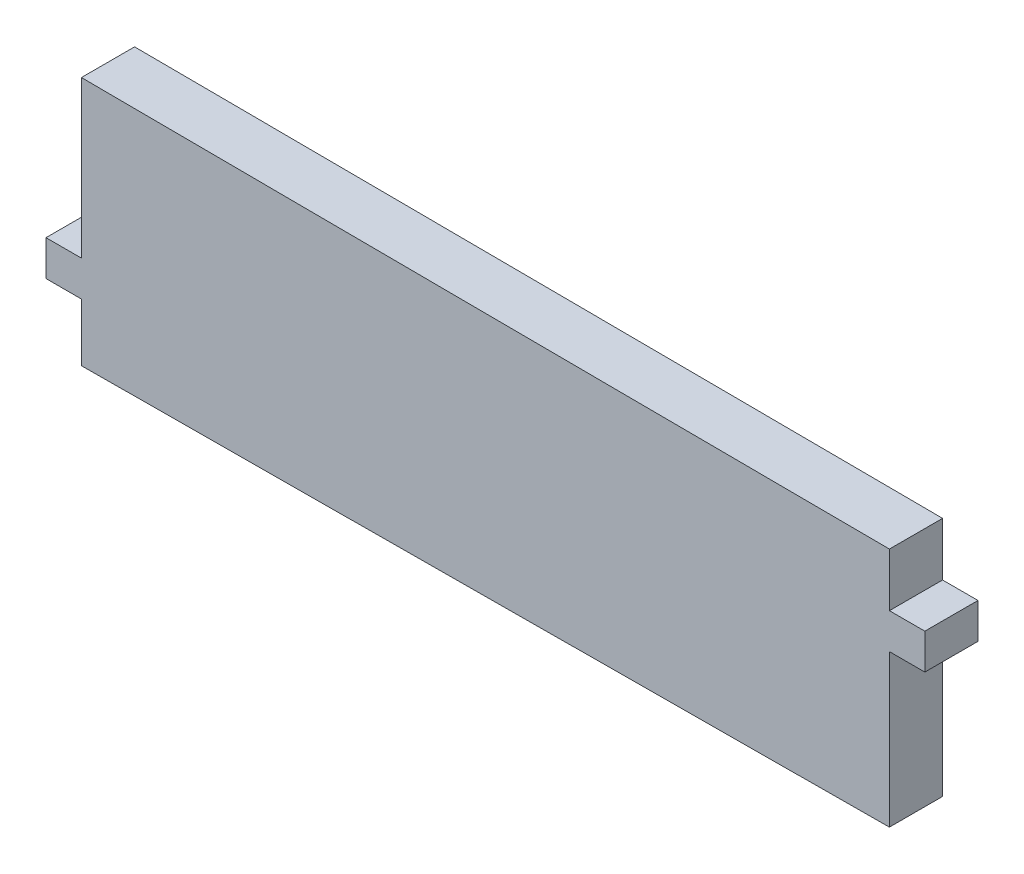
ISO-10303-21;
HEADER;
FILE_DESCRIPTION(('STEP AP214'),'2;1');
FILE_NAME('part.step','',(''),(''),'','','');
FILE_SCHEMA(('AUTOMOTIVE_DESIGN { 1 0 10303 214 1 1 1 1 }'));
ENDSEC;
DATA;
#1=APPLICATION_CONTEXT('core data for automotive mechanical design processes');
#2=APPLICATION_PROTOCOL_DEFINITION('international standard','automotive_design',2000,#1);
#3=PRODUCT_CONTEXT('',#1,'mechanical');
#4=PRODUCT('Part','Part','',(#3));
#5=PRODUCT_RELATED_PRODUCT_CATEGORY('part','',(#4));
#6=PRODUCT_DEFINITION_FORMATION('','',#4);
#7=PRODUCT_DEFINITION_CONTEXT('part definition',#1,'design');
#8=PRODUCT_DEFINITION('design','',#6,#7);
#9=PRODUCT_DEFINITION_SHAPE('','',#8);
#10=(LENGTH_UNIT() NAMED_UNIT(*) SI_UNIT(.MILLI.,.METRE.));
#11=(NAMED_UNIT(*) PLANE_ANGLE_UNIT() SI_UNIT($,.RADIAN.));
#12=(NAMED_UNIT(*) SI_UNIT($,.STERADIAN.) SOLID_ANGLE_UNIT());
#13=UNCERTAINTY_MEASURE_WITH_UNIT(LENGTH_MEASURE(1.E-05),#10,'distance_accuracy_value','');
#14=(GEOMETRIC_REPRESENTATION_CONTEXT(3) GLOBAL_UNCERTAINTY_ASSIGNED_CONTEXT((#13)) GLOBAL_UNIT_ASSIGNED_CONTEXT((#10,
#11,#12)) REPRESENTATION_CONTEXT('',''));
#15=CARTESIAN_POINT('',(0.,0.,0.));
#16=DIRECTION('',(0.,0.,1.));
#17=DIRECTION('',(1.,0.,0.));
#18=AXIS2_PLACEMENT_3D('',#15,#16,#17);
#19=CARTESIAN_POINT('',(84.671798957982,-9.79492731447698,86.6164298576074));
#20=DIRECTION('',(1.,0.,0.));
#21=DIRECTION('',(0.,0.,-1.));
#22=AXIS2_PLACEMENT_3D('',#19,#20,#21);
#23=PLANE('',#22);
#24=DIRECTION('',(0.,-1.,0.));
#25=VECTOR('',#24,1.);
#26=CARTESIAN_POINT('',(84.671798957982,-9.79492731447698,4.7625));
#27=LINE('',#26,#25);
#28=CARTESIAN_POINT('',(84.671798957982,-9.79492731447698,4.7625));
#29=VERTEX_POINT('',#28);
#30=CARTESIAN_POINT('',(84.671798957982,-14.9693048165318,4.7625));
#31=VERTEX_POINT('',#30);
#32=EDGE_CURVE('E167',#29,#31,#27,.T.);
#33=ORIENTED_EDGE('',*,*,#32,.F.);
#34=DIRECTION('',(0.,0.,-1.));
#35=VECTOR('',#34,1.);
#36=CARTESIAN_POINT('',(84.671798957982,-9.79492731447698,86.6164298576074));
#37=LINE('',#36,#35);
#38=CARTESIAN_POINT('',(84.671798957982,-9.79492731447698,0.));
#39=VERTEX_POINT('',#38);
#40=EDGE_CURVE('E36',#29,#39,#37,.T.);
#41=ORIENTED_EDGE('',*,*,#40,.T.);
#42=DIRECTION('',(0.,-1.,0.));
#43=VECTOR('',#42,1.);
#44=CARTESIAN_POINT('',(84.671798957982,-9.79492731447698,0.));
#45=LINE('',#44,#43);
#46=CARTESIAN_POINT('',(84.671798957982,-14.9693048165318,0.));
#47=VERTEX_POINT('',#46);
#48=EDGE_CURVE('E175',#39,#47,#45,.T.);
#49=ORIENTED_EDGE('',*,*,#48,.T.);
#50=DIRECTION('',(0.,0.,-1.));
#51=VECTOR('',#50,1.);
#52=CARTESIAN_POINT('',(84.671798957982,-14.9693048165318,86.6164298576074));
#53=LINE('',#52,#51);
#54=EDGE_CURVE('E103',#31,#47,#53,.T.);
#55=ORIENTED_EDGE('',*,*,#54,.F.);
#56=EDGE_LOOP('',(#33,#41,#49,#55));
#57=FACE_BOUND('',#56,.T.);
#58=ADVANCED_FACE('F32',(#57),#23,.F.);
#59=CARTESIAN_POINT('',(157.061798957982,-14.5780269112379,86.6164298576074));
#60=DIRECTION('',(-0.00540505856785546,0.99998539256425,0.));
#61=DIRECTION('',(-0.99998539256425,-0.00540505856785546,0.));
#62=AXIS2_PLACEMENT_3D('',#59,#60,#61);
#63=PLANE('',#62);
#64=DIRECTION('',(0.99998539256425,0.00540505856785546,0.));
#65=VECTOR('',#64,1.);
#66=CARTESIAN_POINT('',(157.061798957982,-14.5780269112379,4.7625));
#67=LINE('',#66,#65);
#68=CARTESIAN_POINT('',(157.061798957982,-14.5780269112379,4.7625));
#69=VERTEX_POINT('',#68);
#70=EDGE_CURVE('E110',#31,#69,#67,.T.);
#71=ORIENTED_EDGE('',*,*,#70,.F.);
#72=ORIENTED_EDGE('',*,*,#54,.T.);
#73=DIRECTION('',(0.99998539256425,0.00540505856785546,0.));
#74=VECTOR('',#73,1.);
#75=CARTESIAN_POINT('',(157.061798957982,-14.5780269112379,0.));
#76=LINE('',#75,#74);
#77=CARTESIAN_POINT('',(157.061798957982,-14.5780269112379,0.));
#78=VERTEX_POINT('',#77);
#79=EDGE_CURVE('E174',#47,#78,#76,.T.);
#80=ORIENTED_EDGE('',*,*,#79,.T.);
#81=DIRECTION('',(0.,0.,-1.));
#82=VECTOR('',#81,1.);
#83=CARTESIAN_POINT('',(157.061798957982,-14.5780269112379,86.6164298576074));
#84=LINE('',#83,#82);
#85=EDGE_CURVE('E176',#69,#78,#84,.T.);
#86=ORIENTED_EDGE('',*,*,#85,.F.);
#87=EDGE_LOOP('',(#71,#72,#80,#86));
#88=FACE_BOUND('',#87,.T.);
#89=ADVANCED_FACE('F225',(#88),#63,.F.);
#90=CARTESIAN_POINT('',(157.061798957982,-0.955727314476965,86.6164298576074));
#91=DIRECTION('',(-1.,0.,0.));
#92=DIRECTION('',(0.,0.,1.));
#93=AXIS2_PLACEMENT_3D('',#90,#91,#92);
#94=PLANE('',#93);
#95=DIRECTION('',(0.,1.,0.));
#96=VECTOR('',#95,1.);
#97=CARTESIAN_POINT('',(157.061798957982,-0.955727314476965,4.7625));
#98=LINE('',#97,#96);
#99=CARTESIAN_POINT('',(157.061798957982,-0.955727314476965,4.7625));
#100=VERTEX_POINT('',#99);
#101=EDGE_CURVE('E163',#69,#100,#98,.T.);
#102=ORIENTED_EDGE('',*,*,#101,.F.);
#103=ORIENTED_EDGE('',*,*,#85,.T.);
#104=DIRECTION('',(0.,1.,0.));
#105=VECTOR('',#104,1.);
#106=CARTESIAN_POINT('',(157.061798957982,-0.955727314476965,0.));
#107=LINE('',#106,#105);
#108=CARTESIAN_POINT('',(157.061798957982,-0.955727314476965,0.));
#109=VERTEX_POINT('',#108);
#110=EDGE_CURVE('E178',#78,#109,#107,.T.);
#111=ORIENTED_EDGE('',*,*,#110,.T.);
#112=DIRECTION('',(0.,0.,-1.));
#113=VECTOR('',#112,1.);
#114=CARTESIAN_POINT('',(157.061798957982,-0.955727314476965,86.6164298576074));
#115=LINE('',#114,#113);
#116=EDGE_CURVE('E179',#100,#109,#115,.T.);
#117=ORIENTED_EDGE('',*,*,#116,.F.);
#118=EDGE_LOOP('',(#102,#103,#111,#117));
#119=FACE_BOUND('',#118,.T.);
#120=ADVANCED_FACE('F228',(#119),#94,.F.);
#121=CARTESIAN_POINT('',(160.236798957982,-0.955727314476965,86.6164298576074));
#122=DIRECTION('',(0.,1.,0.));
#123=DIRECTION('',(0.,0.,1.));
#124=AXIS2_PLACEMENT_3D('',#121,#122,#123);
#125=PLANE('',#124);
#126=DIRECTION('',(1.,0.,0.));
#127=VECTOR('',#126,1.);
#128=CARTESIAN_POINT('',(160.236798957982,-0.955727314476965,4.7625));
#129=LINE('',#128,#127);
#130=CARTESIAN_POINT('',(160.236798957982,-0.955727314476965,4.7625));
#131=VERTEX_POINT('',#130);
#132=EDGE_CURVE('E160',#100,#131,#129,.T.);
#133=ORIENTED_EDGE('',*,*,#132,.F.);
#134=ORIENTED_EDGE('',*,*,#116,.T.);
#135=DIRECTION('',(1.,0.,0.));
#136=VECTOR('',#135,1.);
#137=CARTESIAN_POINT('',(160.236798957982,-0.955727314476965,0.));
#138=LINE('',#137,#136);
#139=CARTESIAN_POINT('',(160.236798957982,-0.955727314476965,0.));
#140=VERTEX_POINT('',#139);
#141=EDGE_CURVE('E181',#109,#140,#138,.T.);
#142=ORIENTED_EDGE('',*,*,#141,.T.);
#143=DIRECTION('',(0.,0.,-1.));
#144=VECTOR('',#143,1.);
#145=CARTESIAN_POINT('',(160.236798957982,-0.955727314476965,86.6164298576074));
#146=LINE('',#145,#144);
#147=EDGE_CURVE('E182',#131,#140,#146,.T.);
#148=ORIENTED_EDGE('',*,*,#147,.F.);
#149=EDGE_LOOP('',(#133,#134,#142,#148));
#150=FACE_BOUND('',#149,.T.);
#151=ADVANCED_FACE('F230',(#150),#125,.F.);
#152=CARTESIAN_POINT('',(160.236798957982,2.21927268552303,86.6164298576074));
#153=DIRECTION('',(-1.,0.,0.));
#154=DIRECTION('',(0.,0.,1.));
#155=AXIS2_PLACEMENT_3D('',#152,#153,#154);
#156=PLANE('',#155);
#157=DIRECTION('',(0.,1.,0.));
#158=VECTOR('',#157,1.);
#159=CARTESIAN_POINT('',(160.236798957982,2.21927268552303,4.7625));
#160=LINE('',#159,#158);
#161=CARTESIAN_POINT('',(160.236798957982,2.21927268552303,4.7625));
#162=VERTEX_POINT('',#161);
#163=EDGE_CURVE('E157',#131,#162,#160,.T.);
#164=ORIENTED_EDGE('',*,*,#163,.F.);
#165=ORIENTED_EDGE('',*,*,#147,.T.);
#166=DIRECTION('',(0.,1.,0.));
#167=VECTOR('',#166,1.);
#168=CARTESIAN_POINT('',(160.236798957982,2.21927268552303,0.));
#169=LINE('',#168,#167);
#170=CARTESIAN_POINT('',(160.236798957982,2.21927268552303,0.));
#171=VERTEX_POINT('',#170);
#172=EDGE_CURVE('E184',#140,#171,#169,.T.);
#173=ORIENTED_EDGE('',*,*,#172,.T.);
#174=DIRECTION('',(0.,0.,-1.));
#175=VECTOR('',#174,1.);
#176=CARTESIAN_POINT('',(160.236798957982,2.21927268552303,86.6164298576074));
#177=LINE('',#176,#175);
#178=EDGE_CURVE('E185',#162,#171,#177,.T.);
#179=ORIENTED_EDGE('',*,*,#178,.F.);
#180=EDGE_LOOP('',(#164,#165,#173,#179));
#181=FACE_BOUND('',#180,.T.);
#182=ADVANCED_FACE('F234',(#181),#156,.F.);
#183=CARTESIAN_POINT('',(157.061798957982,2.21927268552303,86.6164298576074));
#184=DIRECTION('',(0.,-1.,0.));
#185=DIRECTION('',(0.,0.,-1.));
#186=AXIS2_PLACEMENT_3D('',#183,#184,#185);
#187=PLANE('',#186);
#188=DIRECTION('',(-1.,0.,0.));
#189=VECTOR('',#188,1.);
#190=CARTESIAN_POINT('',(157.061798957982,2.21927268552303,4.7625));
#191=LINE('',#190,#189);
#192=CARTESIAN_POINT('',(157.061798957982,2.21927268552303,4.7625));
#193=VERTEX_POINT('',#192);
#194=EDGE_CURVE('E154',#162,#193,#191,.T.);
#195=ORIENTED_EDGE('',*,*,#194,.F.);
#196=ORIENTED_EDGE('',*,*,#178,.T.);
#197=DIRECTION('',(-1.,0.,0.));
#198=VECTOR('',#197,1.);
#199=CARTESIAN_POINT('',(157.061798957982,2.21927268552303,0.));
#200=LINE('',#199,#198);
#201=CARTESIAN_POINT('',(157.061798957982,2.21927268552303,0.));
#202=VERTEX_POINT('',#201);
#203=EDGE_CURVE('E187',#171,#202,#200,.T.);
#204=ORIENTED_EDGE('',*,*,#203,.T.);
#205=DIRECTION('',(0.,0.,-1.));
#206=VECTOR('',#205,1.);
#207=CARTESIAN_POINT('',(157.061798957982,2.21927268552303,86.6164298576074));
#208=LINE('',#207,#206);
#209=EDGE_CURVE('E188',#193,#202,#208,.T.);
#210=ORIENTED_EDGE('',*,*,#209,.F.);
#211=EDGE_LOOP('',(#195,#196,#204,#210));
#212=FACE_BOUND('',#211,.T.);
#213=ADVANCED_FACE('F239',(#212),#187,.F.);
#214=CARTESIAN_POINT('',(157.061798957982,2.21927268552303,86.6164298576074));
#215=DIRECTION('',(-1.,0.,0.));
#216=DIRECTION('',(0.,-1.,0.));
#217=AXIS2_PLACEMENT_3D('',#214,#215,#216);
#218=PLANE('',#217);
#219=DIRECTION('',(0.,1.,0.));
#220=VECTOR('',#219,1.);
#221=CARTESIAN_POINT('',(157.061798957982,2.21927268552303,4.7625));
#222=LINE('',#221,#220);
#223=CARTESIAN_POINT('',(157.061798957982,7.00220266907081,4.7625));
#224=VERTEX_POINT('',#223);
#225=EDGE_CURVE('E151',#193,#224,#222,.T.);
#226=ORIENTED_EDGE('',*,*,#225,.F.);
#227=ORIENTED_EDGE('',*,*,#209,.T.);
#228=DIRECTION('',(0.,1.,0.));
#229=VECTOR('',#228,1.);
#230=CARTESIAN_POINT('',(157.061798957982,2.21927268552303,0.));
#231=LINE('',#230,#229);
#232=CARTESIAN_POINT('',(157.061798957982,7.00220266907081,0.));
#233=VERTEX_POINT('',#232);
#234=EDGE_CURVE('E190',#202,#233,#231,.T.);
#235=ORIENTED_EDGE('',*,*,#234,.T.);
#236=DIRECTION('',(0.,0.,-1.));
#237=VECTOR('',#236,1.);
#238=CARTESIAN_POINT('',(157.061798957982,7.00220266907081,86.6164298576074));
#239=LINE('',#238,#237);
#240=EDGE_CURVE('E191',#224,#233,#239,.T.);
#241=ORIENTED_EDGE('',*,*,#240,.F.);
#242=EDGE_LOOP('',(#226,#227,#235,#241));
#243=FACE_BOUND('',#242,.T.);
#244=ADVANCED_FACE('F242',(#243),#218,.F.);
#245=CARTESIAN_POINT('',(157.061798957982,7.00220266907081,86.6164298576074));
#246=DIRECTION('',(-0.00540013630427088,-0.999985419157647,0.));
#247=DIRECTION('',(0.999985419157647,-0.00540013630427088,0.));
#248=AXIS2_PLACEMENT_3D('',#245,#246,#247);
#249=PLANE('',#248);
#250=DIRECTION('',(-0.999985419157647,0.00540013630427088,0.));
#251=VECTOR('',#250,1.);
#252=CARTESIAN_POINT('',(157.061798957982,7.00220266907081,4.7625));
#253=LINE('',#252,#251);
#254=CARTESIAN_POINT('',(84.671798957982,7.39312423610272,4.7625));
#255=VERTEX_POINT('',#254);
#256=EDGE_CURVE('E146',#224,#255,#253,.T.);
#257=ORIENTED_EDGE('',*,*,#256,.F.);
#258=ORIENTED_EDGE('',*,*,#240,.T.);
#259=DIRECTION('',(-0.999985419157647,0.00540013630427088,0.));
#260=VECTOR('',#259,1.);
#261=CARTESIAN_POINT('',(157.061798957982,7.00220266907081,0.));
#262=LINE('',#261,#260);
#263=CARTESIAN_POINT('',(84.671798957982,7.39312423610272,0.));
#264=VERTEX_POINT('',#263);
#265=EDGE_CURVE('E193',#233,#264,#262,.T.);
#266=ORIENTED_EDGE('',*,*,#265,.T.);
#267=DIRECTION('',(0.,0.,-1.));
#268=VECTOR('',#267,1.);
#269=CARTESIAN_POINT('',(84.671798957982,7.39312423610272,86.6164298576074));
#270=LINE('',#269,#268);
#271=EDGE_CURVE('E194',#255,#264,#270,.T.);
#272=ORIENTED_EDGE('',*,*,#271,.F.);
#273=EDGE_LOOP('',(#257,#258,#266,#272));
#274=FACE_BOUND('',#273,.T.);
#275=ADVANCED_FACE('F246',(#274),#249,.F.);
#276=CARTESIAN_POINT('',(84.671798957982,-6.61992731447698,86.6164298576074));
#277=DIRECTION('',(1.,0.,0.));
#278=DIRECTION('',(0.,0.,-1.));
#279=AXIS2_PLACEMENT_3D('',#276,#277,#278);
#280=PLANE('',#279);
#281=DIRECTION('',(0.,-1.,0.));
#282=VECTOR('',#281,1.);
#283=CARTESIAN_POINT('',(84.671798957982,-6.61992731447698,4.7625));
#284=LINE('',#283,#282);
#285=CARTESIAN_POINT('',(84.671798957982,-6.61992731447698,4.7625));
#286=VERTEX_POINT('',#285);
#287=EDGE_CURVE('E144',#255,#286,#284,.T.);
#288=ORIENTED_EDGE('',*,*,#287,.F.);
#289=ORIENTED_EDGE('',*,*,#271,.T.);
#290=DIRECTION('',(0.,-1.,0.));
#291=VECTOR('',#290,1.);
#292=CARTESIAN_POINT('',(84.671798957982,-6.61992731447698,0.));
#293=LINE('',#292,#291);
#294=CARTESIAN_POINT('',(84.671798957982,-6.61992731447698,0.));
#295=VERTEX_POINT('',#294);
#296=EDGE_CURVE('E196',#264,#295,#293,.T.);
#297=ORIENTED_EDGE('',*,*,#296,.T.);
#298=DIRECTION('',(0.,0.,-1.));
#299=VECTOR('',#298,1.);
#300=CARTESIAN_POINT('',(84.671798957982,-6.61992731447698,86.6164298576074));
#301=LINE('',#300,#299);
#302=EDGE_CURVE('E197',#286,#295,#301,.T.);
#303=ORIENTED_EDGE('',*,*,#302,.F.);
#304=EDGE_LOOP('',(#288,#289,#297,#303));
#305=FACE_BOUND('',#304,.T.);
#306=ADVANCED_FACE('F250',(#305),#280,.F.);
#307=CARTESIAN_POINT('',(81.496798957982,-6.61992731447698,86.6164298576074));
#308=DIRECTION('',(0.,-1.,0.));
#309=DIRECTION('',(0.,0.,-1.));
#310=AXIS2_PLACEMENT_3D('',#307,#308,#309);
#311=PLANE('',#310);
#312=DIRECTION('',(-1.,0.,0.));
#313=VECTOR('',#312,1.);
#314=CARTESIAN_POINT('',(81.496798957982,-6.61992731447698,4.7625));
#315=LINE('',#314,#313);
#316=CARTESIAN_POINT('',(81.496798957982,-6.61992731447698,4.7625));
#317=VERTEX_POINT('',#316);
#318=EDGE_CURVE('E41',#286,#317,#315,.T.);
#319=ORIENTED_EDGE('',*,*,#318,.F.);
#320=ORIENTED_EDGE('',*,*,#302,.T.);
#321=DIRECTION('',(-1.,0.,0.));
#322=VECTOR('',#321,1.);
#323=CARTESIAN_POINT('',(81.496798957982,-6.61992731447698,0.));
#324=LINE('',#323,#322);
#325=CARTESIAN_POINT('',(81.496798957982,-6.61992731447698,0.));
#326=VERTEX_POINT('',#325);
#327=EDGE_CURVE('E138',#295,#326,#324,.T.);
#328=ORIENTED_EDGE('',*,*,#327,.T.);
#329=DIRECTION('',(0.,0.,-1.));
#330=VECTOR('',#329,1.);
#331=CARTESIAN_POINT('',(81.496798957982,-6.61992731447698,86.6164298576074));
#332=LINE('',#331,#330);
#333=EDGE_CURVE('E129',#317,#326,#332,.T.);
#334=ORIENTED_EDGE('',*,*,#333,.F.);
#335=EDGE_LOOP('',(#319,#320,#328,#334));
#336=FACE_BOUND('',#335,.T.);
#337=ADVANCED_FACE('F135',(#336),#311,.F.);
#338=CARTESIAN_POINT('',(81.496798957982,-9.79492731447698,86.6164298576074));
#339=DIRECTION('',(1.,0.,0.));
#340=DIRECTION('',(0.,0.,-1.));
#341=AXIS2_PLACEMENT_3D('',#338,#339,#340);
#342=PLANE('',#341);
#343=DIRECTION('',(0.,-1.,0.));
#344=VECTOR('',#343,1.);
#345=CARTESIAN_POINT('',(81.496798957982,-9.79492731447698,4.7625));
#346=LINE('',#345,#344);
#347=CARTESIAN_POINT('',(81.496798957982,-9.79492731447698,4.7625));
#348=VERTEX_POINT('',#347);
#349=EDGE_CURVE('E11',#317,#348,#346,.T.);
#350=ORIENTED_EDGE('',*,*,#349,.F.);
#351=ORIENTED_EDGE('',*,*,#333,.T.);
#352=DIRECTION('',(0.,-1.,0.));
#353=VECTOR('',#352,1.);
#354=CARTESIAN_POINT('',(81.496798957982,-9.79492731447698,0.));
#355=LINE('',#354,#353);
#356=CARTESIAN_POINT('',(81.496798957982,-9.79492731447698,0.));
#357=VERTEX_POINT('',#356);
#358=EDGE_CURVE('E140',#326,#357,#355,.T.);
#359=ORIENTED_EDGE('',*,*,#358,.T.);
#360=DIRECTION('',(0.,0.,-1.));
#361=VECTOR('',#360,1.);
#362=CARTESIAN_POINT('',(81.496798957982,-9.79492731447698,86.6164298576074));
#363=LINE('',#362,#361);
#364=EDGE_CURVE('E54',#348,#357,#363,.T.);
#365=ORIENTED_EDGE('',*,*,#364,.F.);
#366=EDGE_LOOP('',(#350,#351,#359,#365));
#367=FACE_BOUND('',#366,.T.);
#368=ADVANCED_FACE('F128',(#367),#342,.F.);
#369=CARTESIAN_POINT('',(84.671798957982,-9.79492731447698,86.6164298576074));
#370=DIRECTION('',(0.,1.,0.));
#371=DIRECTION('',(0.,0.,1.));
#372=AXIS2_PLACEMENT_3D('',#369,#370,#371);
#373=PLANE('',#372);
#374=DIRECTION('',(1.,0.,0.));
#375=VECTOR('',#374,1.);
#376=CARTESIAN_POINT('',(84.671798957982,-9.79492731447698,4.7625));
#377=LINE('',#376,#375);
#378=EDGE_CURVE('E170',#348,#29,#377,.T.);
#379=ORIENTED_EDGE('',*,*,#378,.F.);
#380=ORIENTED_EDGE('',*,*,#364,.T.);
#381=DIRECTION('',(1.,0.,0.));
#382=VECTOR('',#381,1.);
#383=CARTESIAN_POINT('',(84.671798957982,-9.79492731447698,0.));
#384=LINE('',#383,#382);
#385=EDGE_CURVE('E172',#357,#39,#384,.T.);
#386=ORIENTED_EDGE('',*,*,#385,.T.);
#387=ORIENTED_EDGE('',*,*,#40,.F.);
#388=EDGE_LOOP('',(#379,#380,#386,#387));
#389=FACE_BOUND('',#388,.T.);
#390=ADVANCED_FACE('F220',(#389),#373,.F.);
#391=CARTESIAN_POINT('',(0.,0.,0.));
#392=DIRECTION('',(0.,0.,-1.));
#393=DIRECTION('',(-1.,0.,0.));
#394=AXIS2_PLACEMENT_3D('',#391,#392,#393);
#395=PLANE('',#394);
#396=ORIENTED_EDGE('',*,*,#48,.F.);
#397=ORIENTED_EDGE('',*,*,#385,.F.);
#398=ORIENTED_EDGE('',*,*,#358,.F.);
#399=ORIENTED_EDGE('',*,*,#327,.F.);
#400=ORIENTED_EDGE('',*,*,#296,.F.);
#401=ORIENTED_EDGE('',*,*,#265,.F.);
#402=ORIENTED_EDGE('',*,*,#234,.F.);
#403=ORIENTED_EDGE('',*,*,#203,.F.);
#404=ORIENTED_EDGE('',*,*,#172,.F.);
#405=ORIENTED_EDGE('',*,*,#141,.F.);
#406=ORIENTED_EDGE('',*,*,#110,.F.);
#407=ORIENTED_EDGE('',*,*,#79,.F.);
#408=EDGE_LOOP('',(#396,#397,#398,#399,#400,#401,#402,#403,#404,#405,#406,#407));
#409=FACE_BOUND('',#408,.T.);
#410=ADVANCED_FACE('F222',(#409),#395,.T.);
#411=CARTESIAN_POINT('',(311.489607799998,-9.79492731447698,4.7625));
#412=DIRECTION('',(0.,0.,1.));
#413=DIRECTION('',(1.,0.,0.));
#414=AXIS2_PLACEMENT_3D('',#411,#412,#413);
#415=PLANE('',#414);
#416=ORIENTED_EDGE('',*,*,#378,.T.);
#417=ORIENTED_EDGE('',*,*,#32,.T.);
#418=ORIENTED_EDGE('',*,*,#70,.T.);
#419=ORIENTED_EDGE('',*,*,#101,.T.);
#420=ORIENTED_EDGE('',*,*,#132,.T.);
#421=ORIENTED_EDGE('',*,*,#163,.T.);
#422=ORIENTED_EDGE('',*,*,#194,.T.);
#423=ORIENTED_EDGE('',*,*,#225,.T.);
#424=ORIENTED_EDGE('',*,*,#256,.T.);
#425=ORIENTED_EDGE('',*,*,#287,.T.);
#426=ORIENTED_EDGE('',*,*,#318,.T.);
#427=ORIENTED_EDGE('',*,*,#349,.T.);
#428=EDGE_LOOP('',(#416,#417,#418,#419,#420,#421,#422,#423,#424,#425,#426,#427));
#429=FACE_BOUND('',#428,.T.);
#430=ADVANCED_FACE('F34',(#429),#415,.T.);
#431=CLOSED_SHELL('',(#58,#89,#120,#151,#182,#213,#244,#275,#306,#337,#368,#390,#410,#430));
#432=MANIFOLD_SOLID_BREP('B2',#431);
#433=ADVANCED_BREP_SHAPE_REPRESENTATION('',(#18,#432),#14);
#434=SHAPE_DEFINITION_REPRESENTATION(#9,#433);
ENDSEC;
END-ISO-10303-21;
